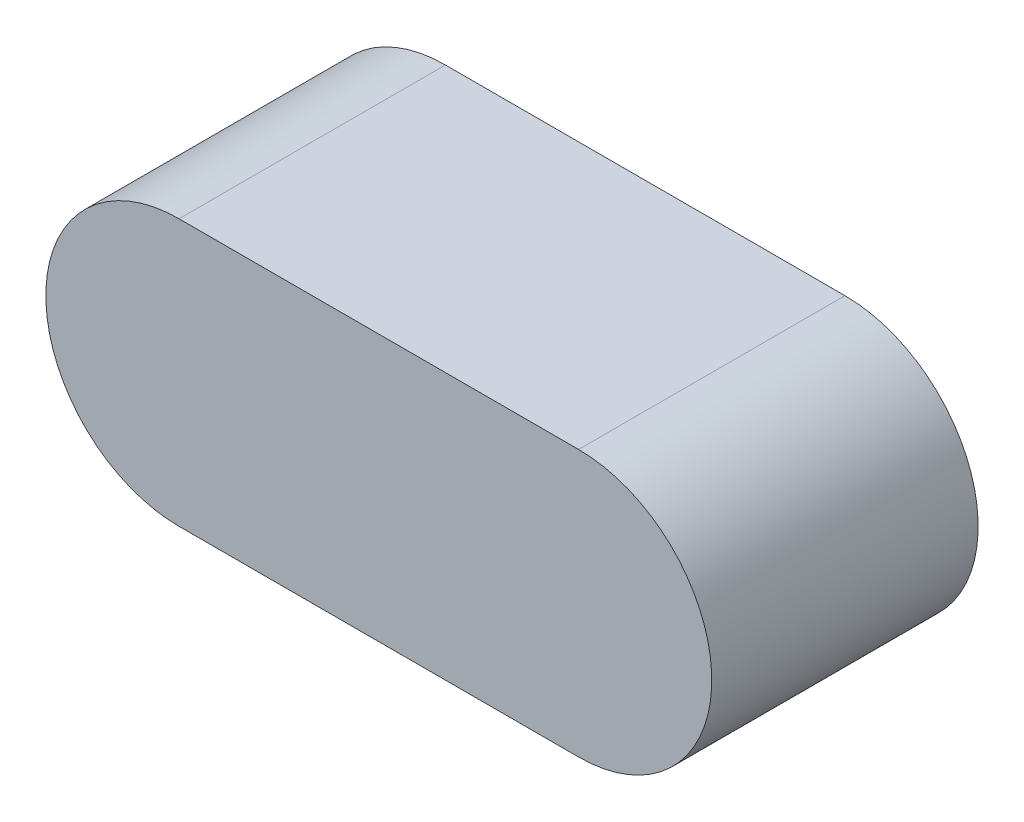
ISO-10303-21;
HEADER;
FILE_DESCRIPTION(('STEP AP214'),'2;1');
FILE_NAME('part.step','',(''),(''),'','','');
FILE_SCHEMA(('AUTOMOTIVE_DESIGN { 1 0 10303 214 1 1 1 1 }'));
ENDSEC;
DATA;
#1=APPLICATION_CONTEXT('core data for automotive mechanical design processes');
#2=APPLICATION_PROTOCOL_DEFINITION('international standard','automotive_design',2000,#1);
#3=PRODUCT_CONTEXT('',#1,'mechanical');
#4=PRODUCT('Part','Part','',(#3));
#5=PRODUCT_RELATED_PRODUCT_CATEGORY('part','',(#4));
#6=PRODUCT_DEFINITION_FORMATION('','',#4);
#7=PRODUCT_DEFINITION_CONTEXT('part definition',#1,'design');
#8=PRODUCT_DEFINITION('design','',#6,#7);
#9=PRODUCT_DEFINITION_SHAPE('','',#8);
#10=(LENGTH_UNIT() NAMED_UNIT(*) SI_UNIT(.MILLI.,.METRE.));
#11=(NAMED_UNIT(*) PLANE_ANGLE_UNIT() SI_UNIT($,.RADIAN.));
#12=(NAMED_UNIT(*) SI_UNIT($,.STERADIAN.) SOLID_ANGLE_UNIT());
#13=UNCERTAINTY_MEASURE_WITH_UNIT(LENGTH_MEASURE(1.E-05),#10,'distance_accuracy_value','');
#14=(GEOMETRIC_REPRESENTATION_CONTEXT(3) GLOBAL_UNCERTAINTY_ASSIGNED_CONTEXT((#13)) GLOBAL_UNIT_ASSIGNED_CONTEXT((#10,
#11,#12)) REPRESENTATION_CONTEXT('',''));
#15=CARTESIAN_POINT('',(0.,0.,0.));
#16=DIRECTION('',(0.,0.,1.));
#17=DIRECTION('',(1.,0.,0.));
#18=AXIS2_PLACEMENT_3D('',#15,#16,#17);
#19=CARTESIAN_POINT('',(-5.,-4.,2.));
#20=DIRECTION('',(0.,1.,0.));
#21=DIRECTION('',(0.,0.,1.));
#22=AXIS2_PLACEMENT_3D('',#19,#20,#21);
#23=PLANE('',#22);
#24=DIRECTION('',(0.,0.,1.));
#25=VECTOR('',#24,1.);
#26=CARTESIAN_POINT('',(2.99999999999998,-4.,-2.));
#27=LINE('',#26,#25);
#28=CARTESIAN_POINT('',(2.99999999999998,-4.,-2.));
#29=VERTEX_POINT('',#28);
#30=CARTESIAN_POINT('',(2.99999999999998,-4.,2.));
#31=VERTEX_POINT('',#30);
#32=EDGE_CURVE('E75',#29,#31,#27,.T.);
#33=ORIENTED_EDGE('',*,*,#32,.T.);
#34=DIRECTION('',(1.,0.,0.));
#35=VECTOR('',#34,1.);
#36=CARTESIAN_POINT('',(-5.,-4.,2.));
#37=LINE('',#36,#35);
#38=CARTESIAN_POINT('',(-3.,-4.00000000000001,2.));
#39=VERTEX_POINT('',#38);
#40=EDGE_CURVE('E42',#39,#31,#37,.T.);
#41=ORIENTED_EDGE('',*,*,#40,.F.);
#42=DIRECTION('',(0.,0.,1.));
#43=VECTOR('',#42,1.);
#44=CARTESIAN_POINT('',(-3.,-4.00000000000001,-2.));
#45=LINE('',#44,#43);
#46=CARTESIAN_POINT('',(-3.,-4.00000000000001,-2.));
#47=VERTEX_POINT('',#46);
#48=EDGE_CURVE('E83',#47,#39,#45,.T.);
#49=ORIENTED_EDGE('',*,*,#48,.F.);
#50=DIRECTION('',(-1.,0.,0.));
#51=VECTOR('',#50,1.);
#52=CARTESIAN_POINT('',(-5.,-4.,-2.));
#53=LINE('',#52,#51);
#54=EDGE_CURVE('E12',#29,#47,#53,.T.);
#55=ORIENTED_EDGE('',*,*,#54,.F.);
#56=EDGE_LOOP('',(#33,#41,#49,#55));
#57=FACE_BOUND('',#56,.T.);
#58=ADVANCED_FACE('F33',(#57),#23,.F.);
#59=CARTESIAN_POINT('',(-5.,0.,2.));
#60=DIRECTION('',(0.,1.,0.));
#61=DIRECTION('',(0.,0.,1.));
#62=AXIS2_PLACEMENT_3D('',#59,#60,#61);
#63=PLANE('',#62);
#64=DIRECTION('',(1.,0.,0.));
#65=VECTOR('',#64,1.);
#66=CARTESIAN_POINT('',(-5.,0.,2.));
#67=LINE('',#66,#65);
#68=CARTESIAN_POINT('',(-3.,0.,2.));
#69=VERTEX_POINT('',#68);
#70=CARTESIAN_POINT('',(2.99999999999998,0.,2.));
#71=VERTEX_POINT('',#70);
#72=EDGE_CURVE('E82',#69,#71,#67,.T.);
#73=ORIENTED_EDGE('',*,*,#72,.T.);
#74=DIRECTION('',(0.,0.,1.));
#75=VECTOR('',#74,1.);
#76=CARTESIAN_POINT('',(2.99999999999998,0.,-2.));
#77=LINE('',#76,#75);
#78=CARTESIAN_POINT('',(2.99999999999998,0.,-2.));
#79=VERTEX_POINT('',#78);
#80=EDGE_CURVE('E95',#79,#71,#77,.T.);
#81=ORIENTED_EDGE('',*,*,#80,.F.);
#82=DIRECTION('',(-1.,0.,0.));
#83=VECTOR('',#82,1.);
#84=CARTESIAN_POINT('',(-5.,0.,-2.));
#85=LINE('',#84,#83);
#86=CARTESIAN_POINT('',(-3.,0.,-2.));
#87=VERTEX_POINT('',#86);
#88=EDGE_CURVE('E37',#79,#87,#85,.T.);
#89=ORIENTED_EDGE('',*,*,#88,.T.);
#90=DIRECTION('',(0.,0.,1.));
#91=VECTOR('',#90,1.);
#92=CARTESIAN_POINT('',(-3.,0.,-2.));
#93=LINE('',#92,#91);
#94=EDGE_CURVE('E93',#87,#69,#93,.T.);
#95=ORIENTED_EDGE('',*,*,#94,.T.);
#96=EDGE_LOOP('',(#73,#81,#89,#95));
#97=FACE_BOUND('',#96,.T.);
#98=ADVANCED_FACE('F102',(#97),#63,.T.);
#99=CARTESIAN_POINT('',(-5.,-4.,-2.));
#100=DIRECTION('',(0.,0.,-1.));
#101=DIRECTION('',(-1.,0.,0.));
#102=AXIS2_PLACEMENT_3D('',#99,#100,#101);
#103=PLANE('',#102);
#104=CARTESIAN_POINT('',(2.99999999999998,-2.,-2.));
#105=DIRECTION('',(0.,0.,-1.));
#106=DIRECTION('',(-1.,0.,0.));
#107=AXIS2_PLACEMENT_3D('',#104,#105,#106);
#108=CIRCLE('',#107,2.);
#109=EDGE_CURVE('E50',#79,#29,#108,.T.);
#110=ORIENTED_EDGE('',*,*,#109,.T.);
#111=ORIENTED_EDGE('',*,*,#54,.T.);
#112=CARTESIAN_POINT('',(-3.,-2.,-2.));
#113=DIRECTION('',(0.,0.,-1.));
#114=DIRECTION('',(-1.,0.,0.));
#115=AXIS2_PLACEMENT_3D('',#112,#113,#114);
#116=CIRCLE('',#115,2.);
#117=EDGE_CURVE('E90',#47,#87,#116,.T.);
#118=ORIENTED_EDGE('',*,*,#117,.T.);
#119=ORIENTED_EDGE('',*,*,#88,.F.);
#120=EDGE_LOOP('',(#110,#111,#118,#119));
#121=FACE_BOUND('',#120,.T.);
#122=ADVANCED_FACE('F87',(#121),#103,.T.);
#123=CARTESIAN_POINT('',(-5.,-4.,2.));
#124=DIRECTION('',(0.,0.,1.));
#125=DIRECTION('',(1.,0.,0.));
#126=AXIS2_PLACEMENT_3D('',#123,#124,#125);
#127=PLANE('',#126);
#128=CARTESIAN_POINT('',(2.99999999999998,-2.,2.));
#129=DIRECTION('',(0.,0.,-1.));
#130=DIRECTION('',(-1.,0.,0.));
#131=AXIS2_PLACEMENT_3D('',#128,#129,#130);
#132=CIRCLE('',#131,2.);
#133=EDGE_CURVE('E77',#71,#31,#132,.T.);
#134=ORIENTED_EDGE('',*,*,#133,.F.);
#135=ORIENTED_EDGE('',*,*,#72,.F.);
#136=CARTESIAN_POINT('',(-3.,-2.,2.));
#137=DIRECTION('',(0.,0.,-1.));
#138=DIRECTION('',(-1.,0.,0.));
#139=AXIS2_PLACEMENT_3D('',#136,#137,#138);
#140=CIRCLE('',#139,2.);
#141=EDGE_CURVE('E58',#39,#69,#140,.T.);
#142=ORIENTED_EDGE('',*,*,#141,.F.);
#143=ORIENTED_EDGE('',*,*,#40,.T.);
#144=EDGE_LOOP('',(#134,#135,#142,#143));
#145=FACE_BOUND('',#144,.T.);
#146=ADVANCED_FACE('F35',(#145),#127,.T.);
#147=CARTESIAN_POINT('',(-3.,-2.,-2.));
#148=DIRECTION('',(0.,0.,1.));
#149=DIRECTION('',(1.,0.,0.));
#150=AXIS2_PLACEMENT_3D('',#147,#148,#149);
#151=CYLINDRICAL_SURFACE('',#150,2.);
#152=ORIENTED_EDGE('',*,*,#141,.T.);
#153=ORIENTED_EDGE('',*,*,#94,.F.);
#154=ORIENTED_EDGE('',*,*,#117,.F.);
#155=ORIENTED_EDGE('',*,*,#48,.T.);
#156=EDGE_LOOP('',(#152,#153,#154,#155));
#157=FACE_BOUND('',#156,.T.);
#158=ADVANCED_FACE('F106',(#157),#151,.T.);
#159=CARTESIAN_POINT('',(2.99999999999998,-2.,-2.));
#160=DIRECTION('',(0.,0.,1.));
#161=DIRECTION('',(1.,0.,0.));
#162=AXIS2_PLACEMENT_3D('',#159,#160,#161);
#163=CYLINDRICAL_SURFACE('',#162,2.);
#164=ORIENTED_EDGE('',*,*,#133,.T.);
#165=ORIENTED_EDGE('',*,*,#32,.F.);
#166=ORIENTED_EDGE('',*,*,#109,.F.);
#167=ORIENTED_EDGE('',*,*,#80,.T.);
#168=EDGE_LOOP('',(#164,#165,#166,#167));
#169=FACE_BOUND('',#168,.T.);
#170=ADVANCED_FACE('F76',(#169),#163,.T.);
#171=CLOSED_SHELL('',(#58,#98,#122,#146,#158,#170));
#172=MANIFOLD_SOLID_BREP('B2',#171);
#173=ADVANCED_BREP_SHAPE_REPRESENTATION('',(#18,#172),#14);
#174=SHAPE_DEFINITION_REPRESENTATION(#9,#173);
ENDSEC;
END-ISO-10303-21;
